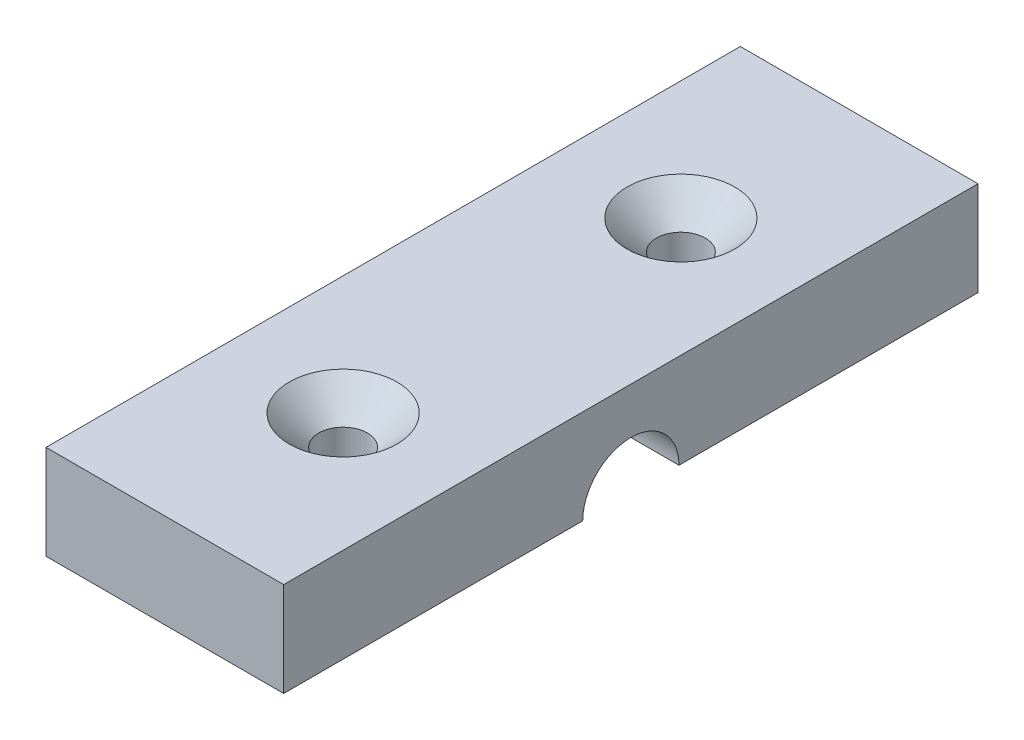
ISO-10303-21;
HEADER;
FILE_DESCRIPTION(('STEP AP214'),'2;1');
FILE_NAME('part.step','',(''),(''),'','','');
FILE_SCHEMA(('AUTOMOTIVE_DESIGN { 1 0 10303 214 1 1 1 1 }'));
ENDSEC;
DATA;
#1=APPLICATION_CONTEXT('core data for automotive mechanical design processes');
#2=APPLICATION_PROTOCOL_DEFINITION('international standard','automotive_design',2000,#1);
#3=PRODUCT_CONTEXT('',#1,'mechanical');
#4=PRODUCT('Part','Part','',(#3));
#5=PRODUCT_RELATED_PRODUCT_CATEGORY('part','',(#4));
#6=PRODUCT_DEFINITION_FORMATION('','',#4);
#7=PRODUCT_DEFINITION_CONTEXT('part definition',#1,'design');
#8=PRODUCT_DEFINITION('design','',#6,#7);
#9=PRODUCT_DEFINITION_SHAPE('','',#8);
#10=(LENGTH_UNIT() NAMED_UNIT(*) SI_UNIT(.MILLI.,.METRE.));
#11=(NAMED_UNIT(*) PLANE_ANGLE_UNIT() SI_UNIT($,.RADIAN.));
#12=(NAMED_UNIT(*) SI_UNIT($,.STERADIAN.) SOLID_ANGLE_UNIT());
#13=UNCERTAINTY_MEASURE_WITH_UNIT(LENGTH_MEASURE(1.E-05),#10,'distance_accuracy_value','');
#14=(GEOMETRIC_REPRESENTATION_CONTEXT(3) GLOBAL_UNCERTAINTY_ASSIGNED_CONTEXT((#13)) GLOBAL_UNIT_ASSIGNED_CONTEXT((#10,
#11,#12)) REPRESENTATION_CONTEXT('',''));
#15=CARTESIAN_POINT('',(0.,0.,0.));
#16=DIRECTION('',(0.,0.,1.));
#17=DIRECTION('',(1.,0.,0.));
#18=AXIS2_PLACEMENT_3D('',#15,#16,#17);
#19=CARTESIAN_POINT('',(0.,-102.131174647806,0.));
#20=DIRECTION('',(0.,1.,0.));
#21=DIRECTION('',(0.,0.,1.));
#22=AXIS2_PLACEMENT_3D('',#19,#20,#21);
#23=PLANE('',#22);
#24=CARTESIAN_POINT('',(78.333864278394,-102.131174647806,48.417324847771));
#25=DIRECTION('',(0.,1.,0.));
#26=DIRECTION('',(0.,0.,1.));
#27=AXIS2_PLACEMENT_3D('',#24,#25,#26);
#28=CIRCLE('',#27,4.53000000000001);
#29=CARTESIAN_POINT('',(78.333864278394,-102.131174647806,52.947324847771));
#30=VERTEX_POINT('',#29);
#31=EDGE_CURVE('E54',#30,#30,#28,.F.);
#32=ORIENTED_EDGE('',*,*,#31,.T.);
#33=EDGE_LOOP('',(#32));
#34=FACE_BOUND('',#33,.T.);
#35=CARTESIAN_POINT('',(78.333864278394,-102.131174647806,76.837324847771));
#36=DIRECTION('',(0.,1.,0.));
#37=DIRECTION('',(0.,0.,1.));
#38=AXIS2_PLACEMENT_3D('',#35,#36,#37);
#39=CIRCLE('',#38,4.52999999999999);
#40=CARTESIAN_POINT('',(78.333864278394,-102.131174647806,81.367324847771));
#41=VERTEX_POINT('',#40);
#42=EDGE_CURVE('E161',#41,#41,#39,.F.);
#43=ORIENTED_EDGE('',*,*,#42,.T.);
#44=EDGE_LOOP('',(#43));
#45=FACE_BOUND('',#44,.T.);
#46=DIRECTION('',(0.,0.,-1.));
#47=VECTOR('',#46,1.);
#48=CARTESIAN_POINT('',(88.3338642783942,-102.131174647806,91.837324847771));
#49=LINE('',#48,#47);
#50=CARTESIAN_POINT('',(88.3338642783942,-102.131174647806,91.837324847771));
#51=VERTEX_POINT('',#50);
#52=CARTESIAN_POINT('',(88.3338642783942,-102.131174647806,33.4173248477711));
#53=VERTEX_POINT('',#52);
#54=EDGE_CURVE('E137',#51,#53,#49,.T.);
#55=ORIENTED_EDGE('',*,*,#54,.T.);
#56=DIRECTION('',(-1.,0.,0.));
#57=VECTOR('',#56,1.);
#58=CARTESIAN_POINT('',(88.3338642783942,-102.131174647806,33.4173248477711));
#59=LINE('',#58,#57);
#60=CARTESIAN_POINT('',(68.3338642783943,-102.131174647806,33.4173248477711));
#61=VERTEX_POINT('',#60);
#62=EDGE_CURVE('E99',#53,#61,#59,.T.);
#63=ORIENTED_EDGE('',*,*,#62,.T.);
#64=DIRECTION('',(0.,0.,1.));
#65=VECTOR('',#64,1.);
#66=CARTESIAN_POINT('',(68.3338642783943,-102.131174647806,91.837324847771));
#67=LINE('',#66,#65);
#68=CARTESIAN_POINT('',(68.3338642783943,-102.131174647806,91.837324847771));
#69=VERTEX_POINT('',#68);
#70=EDGE_CURVE('E140',#61,#69,#67,.T.);
#71=ORIENTED_EDGE('',*,*,#70,.T.);
#72=DIRECTION('',(1.,0.,0.));
#73=VECTOR('',#72,1.);
#74=CARTESIAN_POINT('',(88.3338642783942,-102.131174647806,91.837324847771));
#75=LINE('',#74,#73);
#76=EDGE_CURVE('E70',#69,#51,#75,.T.);
#77=ORIENTED_EDGE('',*,*,#76,.T.);
#78=EDGE_LOOP('',(#55,#63,#71,#77));
#79=FACE_BOUND('',#78,.T.);
#80=ADVANCED_FACE('F46',(#34,#45,#79),#23,.T.);
#81=CARTESIAN_POINT('',(0.,-110.068674647806,0.));
#82=DIRECTION('',(0.,1.,0.));
#83=DIRECTION('',(0.,0.,1.));
#84=AXIS2_PLACEMENT_3D('',#81,#82,#83);
#85=PLANE('',#84);
#86=DIRECTION('',(0.,0.,-1.));
#87=VECTOR('',#86,1.);
#88=CARTESIAN_POINT('',(73.3338642783942,-110.068674647806,0.));
#89=LINE('',#88,#87);
#90=CARTESIAN_POINT('',(73.3338642783942,-110.068674647806,66.677324847771));
#91=VERTEX_POINT('',#90);
#92=CARTESIAN_POINT('',(73.3338642783942,-110.068674647806,58.577324847771));
#93=VERTEX_POINT('',#92);
#94=EDGE_CURVE('E110',#91,#93,#89,.T.);
#95=ORIENTED_EDGE('',*,*,#94,.F.);
#96=DIRECTION('',(1.,0.,0.));
#97=VECTOR('',#96,1.);
#98=CARTESIAN_POINT('',(73.3338642783942,-110.068674647806,66.677324847771));
#99=LINE('',#98,#97);
#100=CARTESIAN_POINT('',(88.3338642783942,-110.068674647806,66.677324847771));
#101=VERTEX_POINT('',#100);
#102=EDGE_CURVE('E119',#91,#101,#99,.T.);
#103=ORIENTED_EDGE('',*,*,#102,.T.);
#104=DIRECTION('',(0.,0.,-1.));
#105=VECTOR('',#104,1.);
#106=CARTESIAN_POINT('',(88.3338642783942,-110.068674647806,91.837324847771));
#107=LINE('',#106,#105);
#108=CARTESIAN_POINT('',(88.3338642783942,-110.068674647806,91.837324847771));
#109=VERTEX_POINT('',#108);
#110=EDGE_CURVE('E144',#109,#101,#107,.T.);
#111=ORIENTED_EDGE('',*,*,#110,.F.);
#112=DIRECTION('',(1.,0.,0.));
#113=VECTOR('',#112,1.);
#114=CARTESIAN_POINT('',(88.3338642783942,-110.068674647806,91.837324847771));
#115=LINE('',#114,#113);
#116=CARTESIAN_POINT('',(68.3338642783943,-110.068674647806,91.837324847771));
#117=VERTEX_POINT('',#116);
#118=EDGE_CURVE('E91',#117,#109,#115,.T.);
#119=ORIENTED_EDGE('',*,*,#118,.F.);
#120=DIRECTION('',(0.,0.,1.));
#121=VECTOR('',#120,1.);
#122=CARTESIAN_POINT('',(68.3338642783943,-110.068674647806,91.837324847771));
#123=LINE('',#122,#121);
#124=CARTESIAN_POINT('',(68.3338642783943,-110.068674647806,33.4173248477711));
#125=VERTEX_POINT('',#124);
#126=EDGE_CURVE('E149',#125,#117,#123,.T.);
#127=ORIENTED_EDGE('',*,*,#126,.F.);
#128=DIRECTION('',(-1.,0.,0.));
#129=VECTOR('',#128,1.);
#130=CARTESIAN_POINT('',(88.3338642783942,-110.068674647806,33.4173248477711));
#131=LINE('',#130,#129);
#132=CARTESIAN_POINT('',(88.3338642783942,-110.068674647806,33.4173248477711));
#133=VERTEX_POINT('',#132);
#134=EDGE_CURVE('E147',#133,#125,#131,.T.);
#135=ORIENTED_EDGE('',*,*,#134,.F.);
#136=CARTESIAN_POINT('',(88.3338642783942,-110.068674647806,58.577324847771));
#137=VERTEX_POINT('',#136);
#138=EDGE_CURVE('E126',#137,#133,#107,.T.);
#139=ORIENTED_EDGE('',*,*,#138,.F.);
#140=DIRECTION('',(1.,0.,0.));
#141=VECTOR('',#140,1.);
#142=CARTESIAN_POINT('',(73.3338642783942,-110.068674647806,58.577324847771));
#143=LINE('',#142,#141);
#144=EDGE_CURVE('E61',#137,#93,#143,.F.);
#145=ORIENTED_EDGE('',*,*,#144,.T.);
#146=EDGE_LOOP('',(#95,#103,#111,#119,#127,#135,#139,#145));
#147=FACE_BOUND('',#146,.T.);
#148=CARTESIAN_POINT('',(78.333864278394,-110.068674647806,76.837324847771));
#149=DIRECTION('',(0.,1.,0.));
#150=DIRECTION('',(0.,0.,1.));
#151=AXIS2_PLACEMENT_3D('',#148,#149,#150);
#152=CIRCLE('',#151,2.04999999999998);
#153=CARTESIAN_POINT('',(78.333864278394,-110.068674647806,78.887324847771));
#154=VERTEX_POINT('',#153);
#155=EDGE_CURVE('E134',#154,#154,#152,.T.);
#156=ORIENTED_EDGE('',*,*,#155,.T.);
#157=EDGE_LOOP('',(#156));
#158=FACE_BOUND('',#157,.T.);
#159=CARTESIAN_POINT('',(78.333864278394,-110.068674647806,48.417324847771));
#160=DIRECTION('',(0.,1.,0.));
#161=DIRECTION('',(0.,0.,1.));
#162=AXIS2_PLACEMENT_3D('',#159,#160,#161);
#163=CIRCLE('',#162,2.04999999999998);
#164=CARTESIAN_POINT('',(78.333864278394,-110.068674647806,50.467324847771));
#165=VERTEX_POINT('',#164);
#166=EDGE_CURVE('E128',#165,#165,#163,.T.);
#167=ORIENTED_EDGE('',*,*,#166,.T.);
#168=EDGE_LOOP('',(#167));
#169=FACE_BOUND('',#168,.T.);
#170=ADVANCED_FACE('F123',(#147,#158,#169),#85,.F.);
#171=CARTESIAN_POINT('',(88.3338642783942,-102.131174647806,91.837324847771));
#172=DIRECTION('',(-1.,0.,0.));
#173=DIRECTION('',(0.,0.,1.));
#174=AXIS2_PLACEMENT_3D('',#171,#172,#173);
#175=PLANE('',#174);
#176=ORIENTED_EDGE('',*,*,#110,.T.);
#177=CARTESIAN_POINT('',(88.3338642783942,-110.068674647806,62.627324847771));
#178=DIRECTION('',(1.,0.,0.));
#179=DIRECTION('',(0.,0.,-1.));
#180=AXIS2_PLACEMENT_3D('',#177,#178,#179);
#181=CIRCLE('',#180,4.05);
#182=EDGE_CURVE('E120',#137,#101,#181,.T.);
#183=ORIENTED_EDGE('',*,*,#182,.F.);
#184=ORIENTED_EDGE('',*,*,#138,.T.);
#185=DIRECTION('',(0.,-1.,0.));
#186=VECTOR('',#185,1.);
#187=CARTESIAN_POINT('',(88.3338642783942,-102.131174647806,33.4173248477711));
#188=LINE('',#187,#186);
#189=EDGE_CURVE('E116',#53,#133,#188,.T.);
#190=ORIENTED_EDGE('',*,*,#189,.F.);
#191=ORIENTED_EDGE('',*,*,#54,.F.);
#192=DIRECTION('',(0.,-1.,0.));
#193=VECTOR('',#192,1.);
#194=CARTESIAN_POINT('',(88.3338642783942,-102.131174647806,91.837324847771));
#195=LINE('',#194,#193);
#196=EDGE_CURVE('E143',#51,#109,#195,.T.);
#197=ORIENTED_EDGE('',*,*,#196,.T.);
#198=EDGE_LOOP('',(#176,#183,#184,#190,#191,#197));
#199=FACE_BOUND('',#198,.T.);
#200=ADVANCED_FACE('F181',(#199),#175,.F.);
#201=CARTESIAN_POINT('',(88.3338642783942,-102.131174647806,33.4173248477711));
#202=DIRECTION('',(0.,0.,1.));
#203=DIRECTION('',(1.,0.,0.));
#204=AXIS2_PLACEMENT_3D('',#201,#202,#203);
#205=PLANE('',#204);
#206=ORIENTED_EDGE('',*,*,#134,.T.);
#207=DIRECTION('',(0.,-1.,0.));
#208=VECTOR('',#207,1.);
#209=CARTESIAN_POINT('',(68.3338642783943,-102.131174647806,33.4173248477711));
#210=LINE('',#209,#208);
#211=EDGE_CURVE('E155',#61,#125,#210,.T.);
#212=ORIENTED_EDGE('',*,*,#211,.F.);
#213=ORIENTED_EDGE('',*,*,#62,.F.);
#214=ORIENTED_EDGE('',*,*,#189,.T.);
#215=EDGE_LOOP('',(#206,#212,#213,#214));
#216=FACE_BOUND('',#215,.T.);
#217=ADVANCED_FACE('F187',(#216),#205,.F.);
#218=CARTESIAN_POINT('',(68.3338642783943,-102.131174647806,91.837324847771));
#219=DIRECTION('',(1.,0.,0.));
#220=DIRECTION('',(0.,0.,-1.));
#221=AXIS2_PLACEMENT_3D('',#218,#219,#220);
#222=PLANE('',#221);
#223=ORIENTED_EDGE('',*,*,#126,.T.);
#224=DIRECTION('',(0.,-1.,0.));
#225=VECTOR('',#224,1.);
#226=CARTESIAN_POINT('',(68.3338642783943,-102.131174647806,91.837324847771));
#227=LINE('',#226,#225);
#228=EDGE_CURVE('E153',#69,#117,#227,.T.);
#229=ORIENTED_EDGE('',*,*,#228,.F.);
#230=ORIENTED_EDGE('',*,*,#70,.F.);
#231=ORIENTED_EDGE('',*,*,#211,.T.);
#232=EDGE_LOOP('',(#223,#229,#230,#231));
#233=FACE_BOUND('',#232,.T.);
#234=ADVANCED_FACE('F196',(#233),#222,.F.);
#235=CARTESIAN_POINT('',(88.3338642783942,-102.131174647806,91.837324847771));
#236=DIRECTION('',(0.,0.,-1.));
#237=DIRECTION('',(-1.,0.,0.));
#238=AXIS2_PLACEMENT_3D('',#235,#236,#237);
#239=PLANE('',#238);
#240=ORIENTED_EDGE('',*,*,#118,.T.);
#241=ORIENTED_EDGE('',*,*,#196,.F.);
#242=ORIENTED_EDGE('',*,*,#76,.F.);
#243=ORIENTED_EDGE('',*,*,#228,.T.);
#244=EDGE_LOOP('',(#240,#241,#242,#243));
#245=FACE_BOUND('',#244,.T.);
#246=ADVANCED_FACE('F193',(#245),#239,.F.);
#247=CARTESIAN_POINT('',(78.333864278394,-102.131174647806,76.837324847771));
#248=DIRECTION('',(0.,-1.,0.));
#249=DIRECTION('',(0.,0.,-1.));
#250=AXIS2_PLACEMENT_3D('',#247,#248,#249);
#251=CYLINDRICAL_SURFACE('',#250,2.04999999999998);
#252=CARTESIAN_POINT('',(78.333864278394,-104.611174647806,76.837324847771));
#253=DIRECTION('',(0.,1.,0.));
#254=DIRECTION('',(0.,0.,1.));
#255=AXIS2_PLACEMENT_3D('',#252,#253,#254);
#256=CIRCLE('',#255,2.04999999999998);
#257=CARTESIAN_POINT('',(78.333864278394,-104.611174647806,78.887324847771));
#258=VERTEX_POINT('',#257);
#259=EDGE_CURVE('E13',#258,#258,#256,.T.);
#260=ORIENTED_EDGE('',*,*,#259,.T.);
#261=EDGE_LOOP('',(#260));
#262=FACE_BOUND('',#261,.T.);
#263=ORIENTED_EDGE('',*,*,#155,.F.);
#264=EDGE_LOOP('',(#263));
#265=FACE_BOUND('',#264,.T.);
#266=ADVANCED_FACE('F176',(#262,#265),#251,.F.);
#267=CARTESIAN_POINT('',(78.333864278394,-102.131174647806,48.417324847771));
#268=DIRECTION('',(0.,-1.,0.));
#269=DIRECTION('',(0.,0.,-1.));
#270=AXIS2_PLACEMENT_3D('',#267,#268,#269);
#271=CYLINDRICAL_SURFACE('',#270,2.04999999999998);
#272=CARTESIAN_POINT('',(78.333864278394,-104.611174647806,48.417324847771));
#273=DIRECTION('',(0.,1.,0.));
#274=DIRECTION('',(0.,0.,1.));
#275=AXIS2_PLACEMENT_3D('',#272,#273,#274);
#276=CIRCLE('',#275,2.04999999999998);
#277=CARTESIAN_POINT('',(78.333864278394,-104.611174647806,50.467324847771));
#278=VERTEX_POINT('',#277);
#279=EDGE_CURVE('E115',#278,#278,#276,.T.);
#280=ORIENTED_EDGE('',*,*,#279,.T.);
#281=EDGE_LOOP('',(#280));
#282=FACE_BOUND('',#281,.T.);
#283=ORIENTED_EDGE('',*,*,#166,.F.);
#284=EDGE_LOOP('',(#283));
#285=FACE_BOUND('',#284,.T.);
#286=ADVANCED_FACE('F173',(#282,#285),#271,.F.);
#287=CARTESIAN_POINT('',(73.3338642783942,-110.068674647806,62.627324847771));
#288=DIRECTION('',(1.,0.,0.));
#289=DIRECTION('',(0.,0.,-1.));
#290=AXIS2_PLACEMENT_3D('',#287,#288,#289);
#291=PLANE('',#290);
#292=ORIENTED_EDGE('',*,*,#94,.T.);
#293=CARTESIAN_POINT('',(73.3338642783942,-110.068674647806,62.627324847771));
#294=DIRECTION('',(1.,0.,0.));
#295=DIRECTION('',(0.,0.,-1.));
#296=AXIS2_PLACEMENT_3D('',#293,#294,#295);
#297=CIRCLE('',#296,4.05);
#298=EDGE_CURVE('E112',#93,#91,#297,.T.);
#299=ORIENTED_EDGE('',*,*,#298,.T.);
#300=EDGE_LOOP('',(#292,#299));
#301=FACE_BOUND('',#300,.T.);
#302=ADVANCED_FACE('F111',(#301),#291,.T.);
#303=CARTESIAN_POINT('',(73.3338642783942,-110.068674647806,62.627324847771));
#304=DIRECTION('',(1.,0.,0.));
#305=DIRECTION('',(0.,0.,-1.));
#306=AXIS2_PLACEMENT_3D('',#303,#304,#305);
#307=CYLINDRICAL_SURFACE('',#306,4.05);
#308=ORIENTED_EDGE('',*,*,#298,.F.);
#309=ORIENTED_EDGE('',*,*,#144,.F.);
#310=ORIENTED_EDGE('',*,*,#182,.T.);
#311=ORIENTED_EDGE('',*,*,#102,.F.);
#312=EDGE_LOOP('',(#308,#309,#310,#311));
#313=FACE_BOUND('',#312,.T.);
#314=ADVANCED_FACE('F118',(#313),#307,.F.);
#315=CARTESIAN_POINT('',(78.333864278394,-104.611174647806,48.417324847771));
#316=DIRECTION('',(0.,1.,0.));
#317=DIRECTION('',(0.,0.,1.));
#318=AXIS2_PLACEMENT_3D('',#315,#316,#317);
#319=CONICAL_SURFACE('',#318,2.04999999999998,0.785398163397455);
#320=ORIENTED_EDGE('',*,*,#31,.F.);
#321=EDGE_LOOP('',(#320));
#322=FACE_BOUND('',#321,.T.);
#323=ORIENTED_EDGE('',*,*,#279,.F.);
#324=EDGE_LOOP('',(#323));
#325=FACE_BOUND('',#324,.T.);
#326=ADVANCED_FACE('F168',(#322,#325),#319,.F.);
#327=CARTESIAN_POINT('',(78.333864278394,-104.611174647806,76.837324847771));
#328=DIRECTION('',(0.,1.,0.));
#329=DIRECTION('',(0.,0.,1.));
#330=AXIS2_PLACEMENT_3D('',#327,#328,#329);
#331=CONICAL_SURFACE('',#330,2.04999999999998,0.785398163397452);
#332=ORIENTED_EDGE('',*,*,#42,.F.);
#333=EDGE_LOOP('',(#332));
#334=FACE_BOUND('',#333,.T.);
#335=ORIENTED_EDGE('',*,*,#259,.F.);
#336=EDGE_LOOP('',(#335));
#337=FACE_BOUND('',#336,.T.);
#338=ADVANCED_FACE('F48',(#334,#337),#331,.F.);
#339=CLOSED_SHELL('',(#80,#170,#200,#217,#234,#246,#266,#286,#302,#314,#326,#338));
#340=MANIFOLD_SOLID_BREP('B2',#339);
#341=ADVANCED_BREP_SHAPE_REPRESENTATION('',(#18,#340),#14);
#342=SHAPE_DEFINITION_REPRESENTATION(#9,#341);
ENDSEC;
END-ISO-10303-21;
